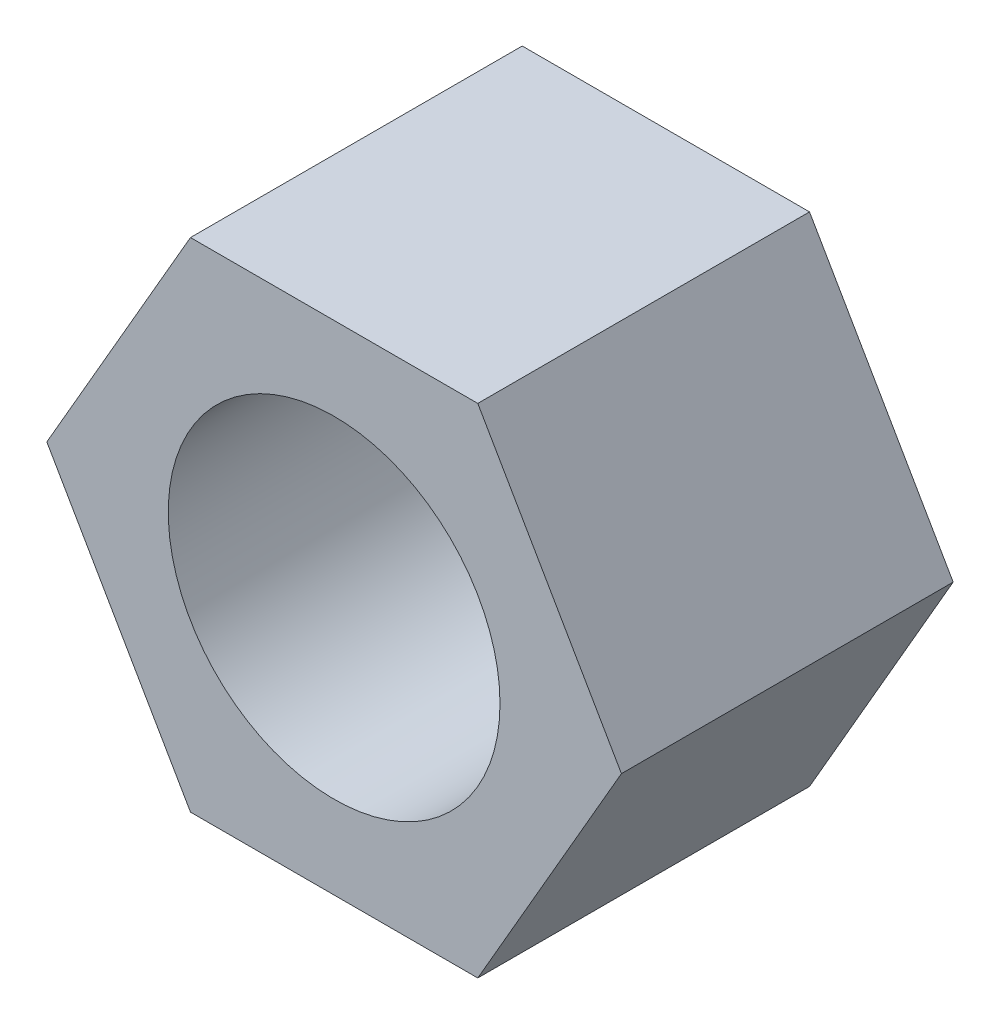
ISO-10303-21;
HEADER;
FILE_DESCRIPTION(('STEP AP214'),'2;1');
FILE_NAME('part.step','',(''),(''),'','','');
FILE_SCHEMA(('AUTOMOTIVE_DESIGN { 1 0 10303 214 1 1 1 1 }'));
ENDSEC;
DATA;
#1=APPLICATION_CONTEXT('core data for automotive mechanical design processes');
#2=APPLICATION_PROTOCOL_DEFINITION('international standard','automotive_design',2000,#1);
#3=PRODUCT_CONTEXT('',#1,'mechanical');
#4=PRODUCT('Part','Part','',(#3));
#5=PRODUCT_RELATED_PRODUCT_CATEGORY('part','',(#4));
#6=PRODUCT_DEFINITION_FORMATION('','',#4);
#7=PRODUCT_DEFINITION_CONTEXT('part definition',#1,'design');
#8=PRODUCT_DEFINITION('design','',#6,#7);
#9=PRODUCT_DEFINITION_SHAPE('','',#8);
#10=(LENGTH_UNIT() NAMED_UNIT(*) SI_UNIT(.MILLI.,.METRE.));
#11=(NAMED_UNIT(*) PLANE_ANGLE_UNIT() SI_UNIT($,.RADIAN.));
#12=(NAMED_UNIT(*) SI_UNIT($,.STERADIAN.) SOLID_ANGLE_UNIT());
#13=UNCERTAINTY_MEASURE_WITH_UNIT(LENGTH_MEASURE(1.E-05),#10,'distance_accuracy_value','');
#14=(GEOMETRIC_REPRESENTATION_CONTEXT(3) GLOBAL_UNCERTAINTY_ASSIGNED_CONTEXT((#13)) GLOBAL_UNIT_ASSIGNED_CONTEXT((#10,
#11,#12)) REPRESENTATION_CONTEXT('',''));
#15=CARTESIAN_POINT('',(0.,0.,0.));
#16=DIRECTION('',(0.,0.,1.));
#17=DIRECTION('',(1.,0.,0.));
#18=AXIS2_PLACEMENT_3D('',#15,#16,#17);
#19=CARTESIAN_POINT('',(0.,0.,2.));
#20=DIRECTION('',(0.,0.,1.));
#21=DIRECTION('',(1.,0.,0.));
#22=AXIS2_PLACEMENT_3D('',#19,#20,#21);
#23=PLANE('',#22);
#24=DIRECTION('',(0.5,0.866025403784438,0.));
#25=VECTOR('',#24,1.);
#26=CARTESIAN_POINT('',(0.86602540378444,-1.5,2.));
#27=LINE('',#26,#25);
#28=CARTESIAN_POINT('',(0.86602540378444,-1.5,2.));
#29=VERTEX_POINT('',#28);
#30=CARTESIAN_POINT('',(1.73205080756888,0.,2.));
#31=VERTEX_POINT('',#30);
#32=EDGE_CURVE('E146',#29,#31,#27,.T.);
#33=ORIENTED_EDGE('',*,*,#32,.T.);
#34=DIRECTION('',(-0.5,0.866025403784438,0.));
#35=VECTOR('',#34,1.);
#36=CARTESIAN_POINT('',(1.73205080756888,0.,2.));
#37=LINE('',#36,#35);
#38=CARTESIAN_POINT('',(0.866025403784438,1.5,2.));
#39=VERTEX_POINT('',#38);
#40=EDGE_CURVE('E94',#31,#39,#37,.T.);
#41=ORIENTED_EDGE('',*,*,#40,.T.);
#42=DIRECTION('',(-1.,0.,0.));
#43=VECTOR('',#42,1.);
#44=CARTESIAN_POINT('',(0.866025403784438,1.5,2.));
#45=LINE('',#44,#43);
#46=CARTESIAN_POINT('',(-0.866025403784439,1.5,2.));
#47=VERTEX_POINT('',#46);
#48=EDGE_CURVE('E107',#39,#47,#45,.T.);
#49=ORIENTED_EDGE('',*,*,#48,.T.);
#50=DIRECTION('',(-0.5,-0.866025403784438,0.));
#51=VECTOR('',#50,1.);
#52=CARTESIAN_POINT('',(-0.866025403784439,1.5,2.));
#53=LINE('',#52,#51);
#54=CARTESIAN_POINT('',(-1.73205080756888,0.,2.));
#55=VERTEX_POINT('',#54);
#56=EDGE_CURVE('E101',#47,#55,#53,.T.);
#57=ORIENTED_EDGE('',*,*,#56,.T.);
#58=DIRECTION('',(0.5,-0.866025403784438,0.));
#59=VECTOR('',#58,1.);
#60=CARTESIAN_POINT('',(-1.73205080756888,0.,2.));
#61=LINE('',#60,#59);
#62=CARTESIAN_POINT('',(-0.866025403784439,-1.5,2.));
#63=VERTEX_POINT('',#62);
#64=EDGE_CURVE('E105',#55,#63,#61,.T.);
#65=ORIENTED_EDGE('',*,*,#64,.T.);
#66=DIRECTION('',(1.,0.,0.));
#67=VECTOR('',#66,1.);
#68=CARTESIAN_POINT('',(-0.866025403784439,-1.5,2.));
#69=LINE('',#68,#67);
#70=EDGE_CURVE('E57',#63,#29,#69,.T.);
#71=ORIENTED_EDGE('',*,*,#70,.T.);
#72=EDGE_LOOP('',(#33,#41,#49,#57,#65,#71));
#73=FACE_BOUND('',#72,.T.);
#74=CARTESIAN_POINT('',(0.,0.,2.));
#75=DIRECTION('',(0.,0.,1.));
#76=DIRECTION('',(1.,0.,0.));
#77=AXIS2_PLACEMENT_3D('',#74,#75,#76);
#78=CIRCLE('',#77,1.);
#79=CARTESIAN_POINT('',(1.,0.,2.));
#80=VERTEX_POINT('',#79);
#81=EDGE_CURVE('E134',#80,#80,#78,.T.);
#82=ORIENTED_EDGE('',*,*,#81,.F.);
#83=EDGE_LOOP('',(#82));
#84=FACE_BOUND('',#83,.T.);
#85=ADVANCED_FACE('F39',(#73,#84),#23,.T.);
#86=CARTESIAN_POINT('',(0.,0.,0.));
#87=DIRECTION('',(0.,0.,1.));
#88=DIRECTION('',(1.,0.,0.));
#89=AXIS2_PLACEMENT_3D('',#86,#87,#88);
#90=PLANE('',#89);
#91=DIRECTION('',(0.5,0.866025403784438,0.));
#92=VECTOR('',#91,1.);
#93=CARTESIAN_POINT('',(0.86602540378444,-1.5,0.));
#94=LINE('',#93,#92);
#95=CARTESIAN_POINT('',(0.86602540378444,-1.5,0.));
#96=VERTEX_POINT('',#95);
#97=CARTESIAN_POINT('',(1.73205080756888,0.,0.));
#98=VERTEX_POINT('',#97);
#99=EDGE_CURVE('E129',#96,#98,#94,.T.);
#100=ORIENTED_EDGE('',*,*,#99,.F.);
#101=DIRECTION('',(1.,0.,0.));
#102=VECTOR('',#101,1.);
#103=CARTESIAN_POINT('',(-0.866025403784439,-1.5,0.));
#104=LINE('',#103,#102);
#105=CARTESIAN_POINT('',(-0.866025403784439,-1.5,0.));
#106=VERTEX_POINT('',#105);
#107=EDGE_CURVE('E86',#106,#96,#104,.T.);
#108=ORIENTED_EDGE('',*,*,#107,.F.);
#109=DIRECTION('',(0.5,-0.866025403784438,0.));
#110=VECTOR('',#109,1.);
#111=CARTESIAN_POINT('',(-1.73205080756888,0.,0.));
#112=LINE('',#111,#110);
#113=CARTESIAN_POINT('',(-1.73205080756888,0.,0.));
#114=VERTEX_POINT('',#113);
#115=EDGE_CURVE('E80',#114,#106,#112,.T.);
#116=ORIENTED_EDGE('',*,*,#115,.F.);
#117=DIRECTION('',(-0.5,-0.866025403784438,0.));
#118=VECTOR('',#117,1.);
#119=CARTESIAN_POINT('',(-0.866025403784439,1.5,0.));
#120=LINE('',#119,#118);
#121=CARTESIAN_POINT('',(-0.866025403784439,1.5,0.));
#122=VERTEX_POINT('',#121);
#123=EDGE_CURVE('E116',#122,#114,#120,.T.);
#124=ORIENTED_EDGE('',*,*,#123,.F.);
#125=DIRECTION('',(-1.,0.,0.));
#126=VECTOR('',#125,1.);
#127=CARTESIAN_POINT('',(0.866025403784438,1.5,0.));
#128=LINE('',#127,#126);
#129=CARTESIAN_POINT('',(0.866025403784438,1.5,0.));
#130=VERTEX_POINT('',#129);
#131=EDGE_CURVE('E137',#130,#122,#128,.T.);
#132=ORIENTED_EDGE('',*,*,#131,.F.);
#133=DIRECTION('',(-0.5,0.866025403784438,0.));
#134=VECTOR('',#133,1.);
#135=CARTESIAN_POINT('',(1.73205080756888,0.,0.));
#136=LINE('',#135,#134);
#137=EDGE_CURVE('E133',#98,#130,#136,.T.);
#138=ORIENTED_EDGE('',*,*,#137,.F.);
#139=EDGE_LOOP('',(#100,#108,#116,#124,#132,#138));
#140=FACE_BOUND('',#139,.T.);
#141=CARTESIAN_POINT('',(0.,0.,0.));
#142=DIRECTION('',(0.,0.,1.));
#143=DIRECTION('',(1.,0.,0.));
#144=AXIS2_PLACEMENT_3D('',#141,#142,#143);
#145=CIRCLE('',#144,1.);
#146=CARTESIAN_POINT('',(1.,0.,0.));
#147=VERTEX_POINT('',#146);
#148=EDGE_CURVE('E243',#147,#147,#145,.T.);
#149=ORIENTED_EDGE('',*,*,#148,.T.);
#150=EDGE_LOOP('',(#149));
#151=FACE_BOUND('',#150,.T.);
#152=ADVANCED_FACE('F159',(#140,#151),#90,.F.);
#153=CARTESIAN_POINT('',(0.86602540378444,-1.5,2.));
#154=DIRECTION('',(-0.866025403784439,0.5,0.));
#155=DIRECTION('',(-0.5,-0.866025403784438,0.));
#156=AXIS2_PLACEMENT_3D('',#153,#154,#155);
#157=PLANE('',#156);
#158=ORIENTED_EDGE('',*,*,#99,.T.);
#159=DIRECTION('',(0.,0.,-1.));
#160=VECTOR('',#159,1.);
#161=CARTESIAN_POINT('',(1.73205080756888,0.,2.));
#162=LINE('',#161,#160);
#163=EDGE_CURVE('E11',#31,#98,#162,.T.);
#164=ORIENTED_EDGE('',*,*,#163,.F.);
#165=ORIENTED_EDGE('',*,*,#32,.F.);
#166=DIRECTION('',(0.,0.,-1.));
#167=VECTOR('',#166,1.);
#168=CARTESIAN_POINT('',(0.86602540378444,-1.5,2.));
#169=LINE('',#168,#167);
#170=EDGE_CURVE('E125',#29,#96,#169,.T.);
#171=ORIENTED_EDGE('',*,*,#170,.T.);
#172=EDGE_LOOP('',(#158,#164,#165,#171));
#173=FACE_BOUND('',#172,.T.);
#174=ADVANCED_FACE('F41',(#173),#157,.F.);
#175=CARTESIAN_POINT('',(1.73205080756888,0.,2.));
#176=DIRECTION('',(-0.866025403784438,-0.5,0.));
#177=DIRECTION('',(0.5,-0.866025403784438,0.));
#178=AXIS2_PLACEMENT_3D('',#175,#176,#177);
#179=PLANE('',#178);
#180=ORIENTED_EDGE('',*,*,#137,.T.);
#181=DIRECTION('',(0.,0.,-1.));
#182=VECTOR('',#181,1.);
#183=CARTESIAN_POINT('',(0.866025403784438,1.5,2.));
#184=LINE('',#183,#182);
#185=EDGE_CURVE('E49',#39,#130,#184,.T.);
#186=ORIENTED_EDGE('',*,*,#185,.F.);
#187=ORIENTED_EDGE('',*,*,#40,.F.);
#188=ORIENTED_EDGE('',*,*,#163,.T.);
#189=EDGE_LOOP('',(#180,#186,#187,#188));
#190=FACE_BOUND('',#189,.T.);
#191=ADVANCED_FACE('F184',(#190),#179,.F.);
#192=CARTESIAN_POINT('',(0.866025403784438,1.5,2.));
#193=DIRECTION('',(0.,-1.,0.));
#194=DIRECTION('',(1.,0.,0.));
#195=AXIS2_PLACEMENT_3D('',#192,#193,#194);
#196=PLANE('',#195);
#197=ORIENTED_EDGE('',*,*,#131,.T.);
#198=DIRECTION('',(0.,0.,-1.));
#199=VECTOR('',#198,1.);
#200=CARTESIAN_POINT('',(-0.866025403784439,1.5,2.));
#201=LINE('',#200,#199);
#202=EDGE_CURVE('E118',#47,#122,#201,.T.);
#203=ORIENTED_EDGE('',*,*,#202,.F.);
#204=ORIENTED_EDGE('',*,*,#48,.F.);
#205=ORIENTED_EDGE('',*,*,#185,.T.);
#206=EDGE_LOOP('',(#197,#203,#204,#205));
#207=FACE_BOUND('',#206,.T.);
#208=ADVANCED_FACE('F156',(#207),#196,.F.);
#209=CARTESIAN_POINT('',(-0.866025403784439,1.5,2.));
#210=DIRECTION('',(0.866025403784439,-0.5,0.));
#211=DIRECTION('',(0.5,0.866025403784438,0.));
#212=AXIS2_PLACEMENT_3D('',#209,#210,#211);
#213=PLANE('',#212);
#214=ORIENTED_EDGE('',*,*,#123,.T.);
#215=DIRECTION('',(0.,0.,-1.));
#216=VECTOR('',#215,1.);
#217=CARTESIAN_POINT('',(-1.73205080756888,0.,2.));
#218=LINE('',#217,#216);
#219=EDGE_CURVE('E113',#55,#114,#218,.T.);
#220=ORIENTED_EDGE('',*,*,#219,.F.);
#221=ORIENTED_EDGE('',*,*,#56,.F.);
#222=ORIENTED_EDGE('',*,*,#202,.T.);
#223=EDGE_LOOP('',(#214,#220,#221,#222));
#224=FACE_BOUND('',#223,.T.);
#225=ADVANCED_FACE('F114',(#224),#213,.F.);
#226=CARTESIAN_POINT('',(-1.73205080756888,0.,2.));
#227=DIRECTION('',(0.866025403784438,0.5,0.));
#228=DIRECTION('',(-0.5,0.866025403784438,0.));
#229=AXIS2_PLACEMENT_3D('',#226,#227,#228);
#230=PLANE('',#229);
#231=ORIENTED_EDGE('',*,*,#115,.T.);
#232=DIRECTION('',(0.,0.,-1.));
#233=VECTOR('',#232,1.);
#234=CARTESIAN_POINT('',(-0.866025403784439,-1.5,2.));
#235=LINE('',#234,#233);
#236=EDGE_CURVE('E119',#63,#106,#235,.T.);
#237=ORIENTED_EDGE('',*,*,#236,.F.);
#238=ORIENTED_EDGE('',*,*,#64,.F.);
#239=ORIENTED_EDGE('',*,*,#219,.T.);
#240=EDGE_LOOP('',(#231,#237,#238,#239));
#241=FACE_BOUND('',#240,.T.);
#242=ADVANCED_FACE('F121',(#241),#230,.F.);
#243=CARTESIAN_POINT('',(-0.866025403784439,-1.5,2.));
#244=DIRECTION('',(0.,1.,0.));
#245=DIRECTION('',(-1.,0.,0.));
#246=AXIS2_PLACEMENT_3D('',#243,#244,#245);
#247=PLANE('',#246);
#248=ORIENTED_EDGE('',*,*,#107,.T.);
#249=ORIENTED_EDGE('',*,*,#170,.F.);
#250=ORIENTED_EDGE('',*,*,#70,.F.);
#251=ORIENTED_EDGE('',*,*,#236,.T.);
#252=EDGE_LOOP('',(#248,#249,#250,#251));
#253=FACE_BOUND('',#252,.T.);
#254=ADVANCED_FACE('F164',(#253),#247,.F.);
#255=CARTESIAN_POINT('',(0.,0.,2.));
#256=DIRECTION('',(0.,0.,-1.));
#257=DIRECTION('',(-1.,0.,0.));
#258=AXIS2_PLACEMENT_3D('',#255,#256,#257);
#259=CYLINDRICAL_SURFACE('',#258,1.);
#260=ORIENTED_EDGE('',*,*,#81,.T.);
#261=EDGE_LOOP('',(#260));
#262=FACE_BOUND('',#261,.T.);
#263=ORIENTED_EDGE('',*,*,#148,.F.);
#264=EDGE_LOOP('',(#263));
#265=FACE_BOUND('',#264,.T.);
#266=ADVANCED_FACE('F166',(#262,#265),#259,.F.);
#267=CLOSED_SHELL('',(#85,#152,#174,#191,#208,#225,#242,#254,#266));
#268=MANIFOLD_SOLID_BREP('B2',#267);
#269=ADVANCED_BREP_SHAPE_REPRESENTATION('',(#18,#268),#14);
#270=SHAPE_DEFINITION_REPRESENTATION(#9,#269);
ENDSEC;
END-ISO-10303-21;
